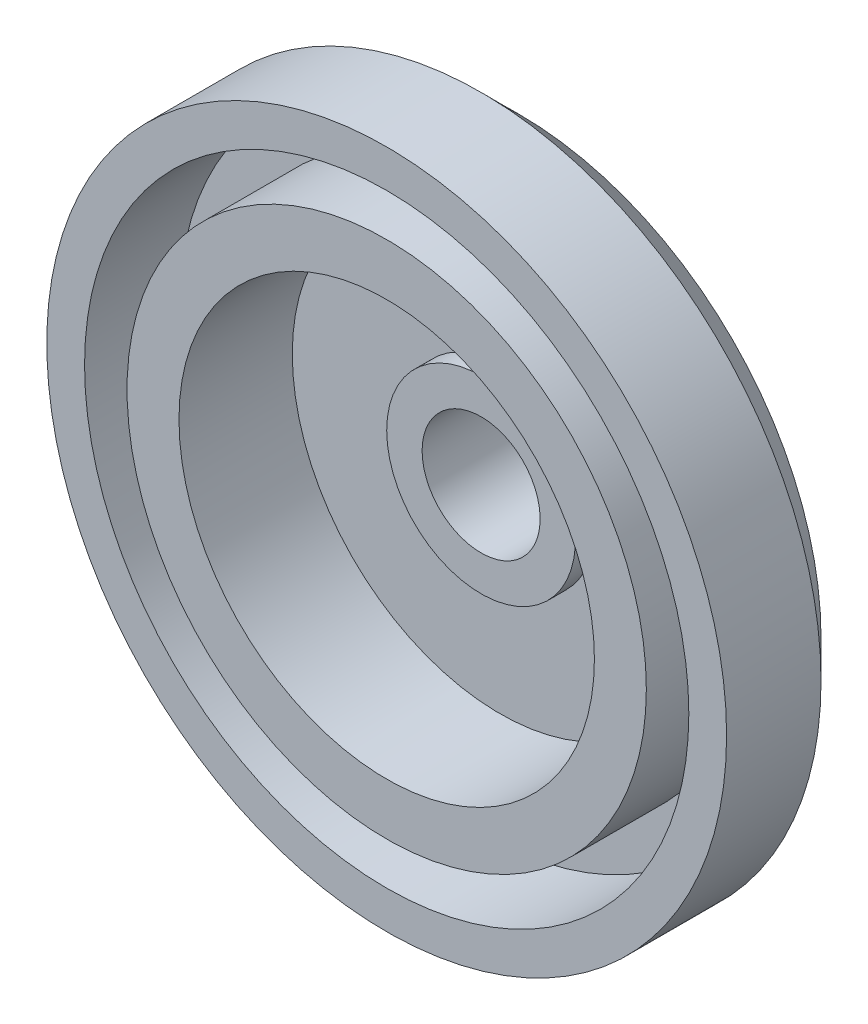
ISO-10303-21;
HEADER;
FILE_DESCRIPTION(('STEP AP214'),'2;1');
FILE_NAME('part.step','',(''),(''),'','','');
FILE_SCHEMA(('AUTOMOTIVE_DESIGN { 1 0 10303 214 1 1 1 1 }'));
ENDSEC;
DATA;
#1=APPLICATION_CONTEXT('core data for automotive mechanical design processes');
#2=APPLICATION_PROTOCOL_DEFINITION('international standard','automotive_design',2000,#1);
#3=PRODUCT_CONTEXT('',#1,'mechanical');
#4=PRODUCT('Part','Part','',(#3));
#5=PRODUCT_RELATED_PRODUCT_CATEGORY('part','',(#4));
#6=PRODUCT_DEFINITION_FORMATION('','',#4);
#7=PRODUCT_DEFINITION_CONTEXT('part definition',#1,'design');
#8=PRODUCT_DEFINITION('design','',#6,#7);
#9=PRODUCT_DEFINITION_SHAPE('','',#8);
#10=(LENGTH_UNIT() NAMED_UNIT(*) SI_UNIT(.MILLI.,.METRE.));
#11=(NAMED_UNIT(*) PLANE_ANGLE_UNIT() SI_UNIT($,.RADIAN.));
#12=(NAMED_UNIT(*) SI_UNIT($,.STERADIAN.) SOLID_ANGLE_UNIT());
#13=UNCERTAINTY_MEASURE_WITH_UNIT(LENGTH_MEASURE(1.E-05),#10,'distance_accuracy_value','');
#14=(GEOMETRIC_REPRESENTATION_CONTEXT(3) GLOBAL_UNCERTAINTY_ASSIGNED_CONTEXT((#13)) GLOBAL_UNIT_ASSIGNED_CONTEXT((#10,
#11,#12)) REPRESENTATION_CONTEXT('',''));
#15=CARTESIAN_POINT('',(0.,0.,0.));
#16=DIRECTION('',(0.,0.,1.));
#17=DIRECTION('',(1.,0.,0.));
#18=AXIS2_PLACEMENT_3D('',#15,#16,#17);
#19=CARTESIAN_POINT('',(0.,0.,7.));
#20=DIRECTION('',(0.,0.,-1.));
#21=DIRECTION('',(-1.,0.,0.));
#22=AXIS2_PLACEMENT_3D('',#19,#20,#21);
#23=CYLINDRICAL_SURFACE('',#22,11.);
#24=CARTESIAN_POINT('',(0.,0.,7.));
#25=DIRECTION('',(0.,0.,1.));
#26=DIRECTION('',(1.,0.,0.));
#27=AXIS2_PLACEMENT_3D('',#24,#25,#26);
#28=CIRCLE('',#27,11.);
#29=CARTESIAN_POINT('',(11.,0.,7.));
#30=VERTEX_POINT('',#29);
#31=EDGE_CURVE('E59',#30,#30,#28,.T.);
#32=ORIENTED_EDGE('',*,*,#31,.T.);
#33=EDGE_LOOP('',(#32));
#34=FACE_BOUND('',#33,.T.);
#35=CARTESIAN_POINT('',(0.,0.,1.));
#36=DIRECTION('',(0.,0.,-1.));
#37=DIRECTION('',(-1.,0.,0.));
#38=AXIS2_PLACEMENT_3D('',#35,#36,#37);
#39=CIRCLE('',#38,11.);
#40=CARTESIAN_POINT('',(-11.,0.,1.));
#41=VERTEX_POINT('',#40);
#42=EDGE_CURVE('E56',#41,#41,#39,.T.);
#43=ORIENTED_EDGE('',*,*,#42,.T.);
#44=EDGE_LOOP('',(#43));
#45=FACE_BOUND('',#44,.T.);
#46=ADVANCED_FACE('F39',(#34,#45),#23,.F.);
#47=CARTESIAN_POINT('',(0.,0.,7.));
#48=DIRECTION('',(0.,0.,-1.));
#49=DIRECTION('',(-1.,0.,0.));
#50=AXIS2_PLACEMENT_3D('',#47,#48,#49);
#51=CYLINDRICAL_SURFACE('',#50,16.);
#52=CARTESIAN_POINT('',(0.,0.,2.));
#53=DIRECTION('',(0.,0.,1.));
#54=DIRECTION('',(1.,0.,0.));
#55=AXIS2_PLACEMENT_3D('',#52,#53,#54);
#56=CIRCLE('',#55,16.);
#57=CARTESIAN_POINT('',(16.,0.,2.));
#58=VERTEX_POINT('',#57);
#59=EDGE_CURVE('E74',#58,#58,#56,.T.);
#60=ORIENTED_EDGE('',*,*,#59,.F.);
#61=EDGE_LOOP('',(#60));
#62=FACE_BOUND('',#61,.T.);
#63=CARTESIAN_POINT('',(0.,0.,7.));
#64=DIRECTION('',(0.,0.,1.));
#65=DIRECTION('',(1.,0.,0.));
#66=AXIS2_PLACEMENT_3D('',#63,#64,#65);
#67=CIRCLE('',#66,16.);
#68=CARTESIAN_POINT('',(16.,0.,7.));
#69=VERTEX_POINT('',#68);
#70=EDGE_CURVE('E68',#69,#69,#67,.T.);
#71=ORIENTED_EDGE('',*,*,#70,.T.);
#72=EDGE_LOOP('',(#71));
#73=FACE_BOUND('',#72,.T.);
#74=ADVANCED_FACE('F94',(#62,#73),#51,.F.);
#75=CARTESIAN_POINT('',(0.,0.,7.));
#76=DIRECTION('',(0.,0.,-1.));
#77=DIRECTION('',(-1.,0.,0.));
#78=AXIS2_PLACEMENT_3D('',#75,#76,#77);
#79=CYLINDRICAL_SURFACE('',#78,18.);
#80=CARTESIAN_POINT('',(0.,0.,2.));
#81=DIRECTION('',(0.,0.,1.));
#82=DIRECTION('',(1.,0.,0.));
#83=AXIS2_PLACEMENT_3D('',#80,#81,#82);
#84=CIRCLE('',#83,18.);
#85=CARTESIAN_POINT('',(18.,0.,2.));
#86=VERTEX_POINT('',#85);
#87=EDGE_CURVE('E77',#86,#86,#84,.T.);
#88=ORIENTED_EDGE('',*,*,#87,.T.);
#89=EDGE_LOOP('',(#88));
#90=FACE_BOUND('',#89,.T.);
#91=CARTESIAN_POINT('',(0.,0.,7.));
#92=DIRECTION('',(0.,0.,1.));
#93=DIRECTION('',(1.,0.,0.));
#94=AXIS2_PLACEMENT_3D('',#91,#92,#93);
#95=CIRCLE('',#94,18.);
#96=CARTESIAN_POINT('',(18.,0.,7.));
#97=VERTEX_POINT('',#96);
#98=EDGE_CURVE('E71',#97,#97,#95,.T.);
#99=ORIENTED_EDGE('',*,*,#98,.F.);
#100=EDGE_LOOP('',(#99));
#101=FACE_BOUND('',#100,.T.);
#102=ADVANCED_FACE('F90',(#90,#101),#79,.T.);
#103=CARTESIAN_POINT('',(0.,0.,7.));
#104=DIRECTION('',(0.,0.,1.));
#105=DIRECTION('',(1.,0.,0.));
#106=AXIS2_PLACEMENT_3D('',#103,#104,#105);
#107=PLANE('',#106);
#108=ORIENTED_EDGE('',*,*,#70,.F.);
#109=EDGE_LOOP('',(#108));
#110=FACE_BOUND('',#109,.T.);
#111=ORIENTED_EDGE('',*,*,#98,.T.);
#112=EDGE_LOOP('',(#111));
#113=FACE_BOUND('',#112,.T.);
#114=ADVANCED_FACE('F93',(#110,#113),#107,.T.);
#115=CARTESIAN_POINT('',(0.,0.,0.));
#116=DIRECTION('',(0.,0.,1.));
#117=DIRECTION('',(1.,0.,0.));
#118=AXIS2_PLACEMENT_3D('',#115,#116,#117);
#119=PLANE('',#118);
#120=CARTESIAN_POINT('',(0.,0.,0.));
#121=DIRECTION('',(0.,0.,1.));
#122=DIRECTION('',(1.,0.,0.));
#123=AXIS2_PLACEMENT_3D('',#120,#121,#122);
#124=CIRCLE('',#123,5.);
#125=CARTESIAN_POINT('',(5.,0.,0.));
#126=VERTEX_POINT('',#125);
#127=EDGE_CURVE('E11',#126,#126,#124,.F.);
#128=ORIENTED_EDGE('',*,*,#127,.F.);
#129=EDGE_LOOP('',(#128));
#130=FACE_BOUND('',#129,.T.);
#131=CARTESIAN_POINT('',(0.,0.,0.));
#132=DIRECTION('',(0.,0.,1.));
#133=DIRECTION('',(1.,0.,0.));
#134=AXIS2_PLACEMENT_3D('',#131,#132,#133);
#135=CIRCLE('',#134,16.);
#136=CARTESIAN_POINT('',(16.,0.,0.));
#137=VERTEX_POINT('',#136);
#138=EDGE_CURVE('E51',#137,#137,#135,.F.);
#139=ORIENTED_EDGE('',*,*,#138,.T.);
#140=EDGE_LOOP('',(#139));
#141=FACE_BOUND('',#140,.T.);
#142=ADVANCED_FACE('F82',(#130,#141),#119,.F.);
#143=CARTESIAN_POINT('',(0.,0.,2.));
#144=DIRECTION('',(0.,0.,1.));
#145=DIRECTION('',(1.,0.,0.));
#146=AXIS2_PLACEMENT_3D('',#143,#144,#145);
#147=PLANE('',#146);
#148=CARTESIAN_POINT('',(0.,0.,2.));
#149=DIRECTION('',(0.,0.,1.));
#150=DIRECTION('',(1.,0.,0.));
#151=AXIS2_PLACEMENT_3D('',#148,#149,#150);
#152=CIRCLE('',#151,13.75);
#153=CARTESIAN_POINT('',(13.75,0.,2.));
#154=VERTEX_POINT('',#153);
#155=EDGE_CURVE('E65',#154,#154,#152,.T.);
#156=ORIENTED_EDGE('',*,*,#155,.F.);
#157=EDGE_LOOP('',(#156));
#158=FACE_BOUND('',#157,.T.);
#159=ORIENTED_EDGE('',*,*,#59,.T.);
#160=EDGE_LOOP('',(#159));
#161=FACE_BOUND('',#160,.T.);
#162=ADVANCED_FACE('F104',(#158,#161),#147,.T.);
#163=CARTESIAN_POINT('',(0.,0.,7.));
#164=DIRECTION('',(0.,0.,-1.));
#165=DIRECTION('',(-1.,0.,0.));
#166=AXIS2_PLACEMENT_3D('',#163,#164,#165);
#167=CYLINDRICAL_SURFACE('',#166,13.75);
#168=ORIENTED_EDGE('',*,*,#155,.T.);
#169=EDGE_LOOP('',(#168));
#170=FACE_BOUND('',#169,.T.);
#171=CARTESIAN_POINT('',(0.,0.,7.));
#172=DIRECTION('',(0.,0.,1.));
#173=DIRECTION('',(1.,0.,0.));
#174=AXIS2_PLACEMENT_3D('',#171,#172,#173);
#175=CIRCLE('',#174,13.75);
#176=CARTESIAN_POINT('',(13.75,0.,7.));
#177=VERTEX_POINT('',#176);
#178=EDGE_CURVE('E62',#177,#177,#175,.T.);
#179=ORIENTED_EDGE('',*,*,#178,.F.);
#180=EDGE_LOOP('',(#179));
#181=FACE_BOUND('',#180,.T.);
#182=ADVANCED_FACE('F118',(#170,#181),#167,.T.);
#183=CARTESIAN_POINT('',(0.,0.,7.));
#184=DIRECTION('',(0.,0.,1.));
#185=DIRECTION('',(1.,0.,0.));
#186=AXIS2_PLACEMENT_3D('',#183,#184,#185);
#187=PLANE('',#186);
#188=ORIENTED_EDGE('',*,*,#31,.F.);
#189=EDGE_LOOP('',(#188));
#190=FACE_BOUND('',#189,.T.);
#191=ORIENTED_EDGE('',*,*,#178,.T.);
#192=EDGE_LOOP('',(#191));
#193=FACE_BOUND('',#192,.T.);
#194=ADVANCED_FACE('F87',(#190,#193),#187,.T.);
#195=CARTESIAN_POINT('',(0.,0.,2.));
#196=DIRECTION('',(0.,0.,1.));
#197=DIRECTION('',(1.,0.,0.));
#198=AXIS2_PLACEMENT_3D('',#195,#196,#197);
#199=CONICAL_SURFACE('',#198,18.,0.78539816339745);
#200=ORIENTED_EDGE('',*,*,#138,.F.);
#201=EDGE_LOOP('',(#200));
#202=FACE_BOUND('',#201,.T.);
#203=ORIENTED_EDGE('',*,*,#87,.F.);
#204=EDGE_LOOP('',(#203));
#205=FACE_BOUND('',#204,.T.);
#206=ADVANCED_FACE('F41',(#202,#205),#199,.T.);
#207=CARTESIAN_POINT('',(0.,0.,1.));
#208=DIRECTION('',(0.,0.,-1.));
#209=DIRECTION('',(-1.,0.,0.));
#210=AXIS2_PLACEMENT_3D('',#207,#208,#209);
#211=PLANE('',#210);
#212=CARTESIAN_POINT('',(0.,0.,1.));
#213=DIRECTION('',(0.,0.,-1.));
#214=DIRECTION('',(-1.,0.,0.));
#215=AXIS2_PLACEMENT_3D('',#212,#213,#214);
#216=CIRCLE('',#215,5.);
#217=CARTESIAN_POINT('',(-5.,0.,1.));
#218=VERTEX_POINT('',#217);
#219=EDGE_CURVE('E43',#218,#218,#216,.F.);
#220=ORIENTED_EDGE('',*,*,#219,.F.);
#221=EDGE_LOOP('',(#220));
#222=FACE_BOUND('',#221,.T.);
#223=ORIENTED_EDGE('',*,*,#42,.F.);
#224=EDGE_LOOP('',(#223));
#225=FACE_BOUND('',#224,.T.);
#226=ADVANCED_FACE('F86',(#222,#225),#211,.F.);
#227=CARTESIAN_POINT('',(0.,0.,-4.));
#228=DIRECTION('',(0.,0.,1.));
#229=DIRECTION('',(1.,0.,0.));
#230=AXIS2_PLACEMENT_3D('',#227,#228,#229);
#231=CYLINDRICAL_SURFACE('',#230,5.);
#232=CARTESIAN_POINT('',(0.,0.,-4.));
#233=DIRECTION('',(0.,0.,-1.));
#234=DIRECTION('',(-1.,0.,0.));
#235=AXIS2_PLACEMENT_3D('',#232,#233,#234);
#236=CIRCLE('',#235,5.);
#237=CARTESIAN_POINT('',(-5.,0.,-4.));
#238=VERTEX_POINT('',#237);
#239=EDGE_CURVE('E54',#238,#238,#236,.T.);
#240=ORIENTED_EDGE('',*,*,#239,.F.);
#241=EDGE_LOOP('',(#240));
#242=FACE_BOUND('',#241,.T.);
#243=ORIENTED_EDGE('',*,*,#127,.T.);
#244=EDGE_LOOP('',(#243));
#245=FACE_BOUND('',#244,.T.);
#246=ADVANCED_FACE('F141',(#242,#245),#231,.T.);
#247=CARTESIAN_POINT('',(0.,0.,2.));
#248=DIRECTION('',(0.,0.,-1.));
#249=DIRECTION('',(-1.,0.,0.));
#250=AXIS2_PLACEMENT_3D('',#247,#248,#249);
#251=CIRCLE('',#250,5.);
#252=CARTESIAN_POINT('',(-5.,0.,2.));
#253=VERTEX_POINT('',#252);
#254=EDGE_CURVE('E166',#253,#253,#251,.T.);
#255=ORIENTED_EDGE('',*,*,#254,.T.);
#256=EDGE_LOOP('',(#255));
#257=FACE_BOUND('',#256,.T.);
#258=ORIENTED_EDGE('',*,*,#219,.T.);
#259=EDGE_LOOP('',(#258));
#260=FACE_BOUND('',#259,.T.);
#261=ADVANCED_FACE('F145',(#257,#260),#231,.T.);
#262=CARTESIAN_POINT('',(0.,0.,-4.));
#263=DIRECTION('',(0.,0.,-1.));
#264=DIRECTION('',(-1.,0.,0.));
#265=AXIS2_PLACEMENT_3D('',#262,#263,#264);
#266=PLANE('',#265);
#267=ORIENTED_EDGE('',*,*,#239,.T.);
#268=EDGE_LOOP('',(#267));
#269=FACE_BOUND('',#268,.T.);
#270=CARTESIAN_POINT('',(0.,0.,-4.));
#271=DIRECTION('',(0.,0.,-1.));
#272=DIRECTION('',(-1.,0.,0.));
#273=AXIS2_PLACEMENT_3D('',#270,#271,#272);
#274=CIRCLE('',#273,3.125);
#275=CARTESIAN_POINT('',(-3.125,0.,-4.));
#276=VERTEX_POINT('',#275);
#277=EDGE_CURVE('E168',#276,#276,#274,.T.);
#278=ORIENTED_EDGE('',*,*,#277,.F.);
#279=EDGE_LOOP('',(#278));
#280=FACE_BOUND('',#279,.T.);
#281=ADVANCED_FACE('F147',(#269,#280),#266,.T.);
#282=CARTESIAN_POINT('',(0.,0.,-4.));
#283=DIRECTION('',(0.,0.,1.));
#284=DIRECTION('',(1.,0.,0.));
#285=AXIS2_PLACEMENT_3D('',#282,#283,#284);
#286=CYLINDRICAL_SURFACE('',#285,3.125);
#287=ORIENTED_EDGE('',*,*,#277,.T.);
#288=EDGE_LOOP('',(#287));
#289=FACE_BOUND('',#288,.T.);
#290=CARTESIAN_POINT('',(0.,0.,2.));
#291=DIRECTION('',(0.,0.,-1.));
#292=DIRECTION('',(-1.,0.,0.));
#293=AXIS2_PLACEMENT_3D('',#290,#291,#292);
#294=CIRCLE('',#293,3.125);
#295=CARTESIAN_POINT('',(-3.125,0.,2.));
#296=VERTEX_POINT('',#295);
#297=EDGE_CURVE('E163',#296,#296,#294,.T.);
#298=ORIENTED_EDGE('',*,*,#297,.F.);
#299=EDGE_LOOP('',(#298));
#300=FACE_BOUND('',#299,.T.);
#301=ADVANCED_FACE('F150',(#289,#300),#286,.F.);
#302=CARTESIAN_POINT('',(0.,0.,2.));
#303=DIRECTION('',(0.,0.,-1.));
#304=DIRECTION('',(-1.,0.,0.));
#305=AXIS2_PLACEMENT_3D('',#302,#303,#304);
#306=PLANE('',#305);
#307=ORIENTED_EDGE('',*,*,#297,.T.);
#308=EDGE_LOOP('',(#307));
#309=FACE_BOUND('',#308,.T.);
#310=ORIENTED_EDGE('',*,*,#254,.F.);
#311=EDGE_LOOP('',(#310));
#312=FACE_BOUND('',#311,.T.);
#313=ADVANCED_FACE('F154',(#309,#312),#306,.F.);
#314=CLOSED_SHELL('',(#46,#74,#102,#114,#142,#162,#182,#194,#206,#226,#246,#261,#281,#301,#313));
#315=MANIFOLD_SOLID_BREP('B2',#314);
#316=ADVANCED_BREP_SHAPE_REPRESENTATION('',(#18,#315),#14);
#317=SHAPE_DEFINITION_REPRESENTATION(#9,#316);
ENDSEC;
END-ISO-10303-21;
